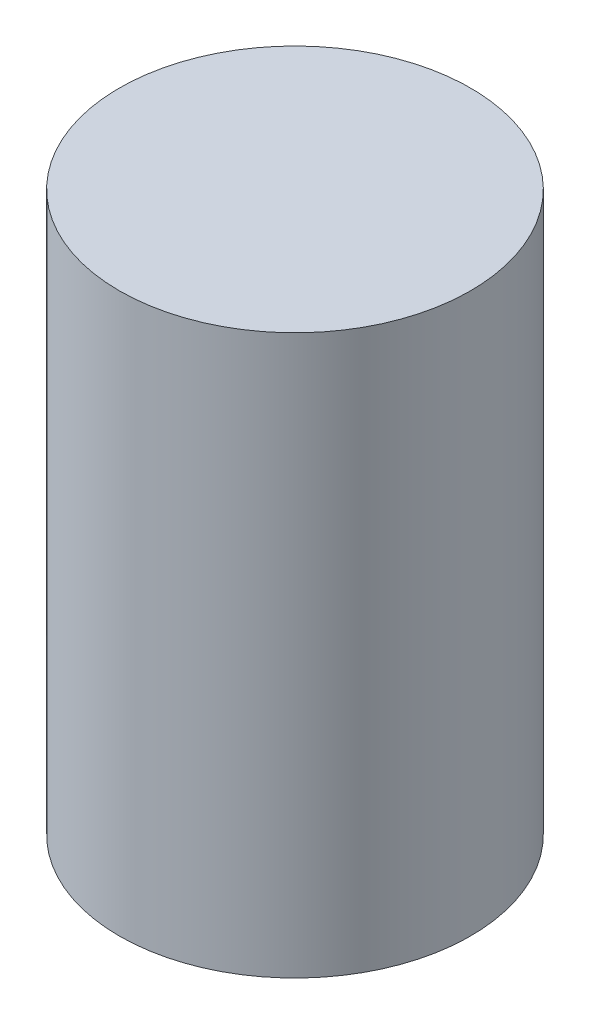
ISO-10303-21;
HEADER;
FILE_DESCRIPTION(('STEP AP214'),'2;1');
FILE_NAME('part.step','',(''),(''),'','','');
FILE_SCHEMA(('AUTOMOTIVE_DESIGN { 1 0 10303 214 1 1 1 1 }'));
ENDSEC;
DATA;
#1=APPLICATION_CONTEXT('core data for automotive mechanical design processes');
#2=APPLICATION_PROTOCOL_DEFINITION('international standard','automotive_design',2000,#1);
#3=PRODUCT_CONTEXT('',#1,'mechanical');
#4=PRODUCT('Part','Part','',(#3));
#5=PRODUCT_RELATED_PRODUCT_CATEGORY('part','',(#4));
#6=PRODUCT_DEFINITION_FORMATION('','',#4);
#7=PRODUCT_DEFINITION_CONTEXT('part definition',#1,'design');
#8=PRODUCT_DEFINITION('design','',#6,#7);
#9=PRODUCT_DEFINITION_SHAPE('','',#8);
#10=(LENGTH_UNIT() NAMED_UNIT(*) SI_UNIT(.MILLI.,.METRE.));
#11=(NAMED_UNIT(*) PLANE_ANGLE_UNIT() SI_UNIT($,.RADIAN.));
#12=(NAMED_UNIT(*) SI_UNIT($,.STERADIAN.) SOLID_ANGLE_UNIT());
#13=UNCERTAINTY_MEASURE_WITH_UNIT(LENGTH_MEASURE(1.E-05),#10,'distance_accuracy_value','');
#14=(GEOMETRIC_REPRESENTATION_CONTEXT(3) GLOBAL_UNCERTAINTY_ASSIGNED_CONTEXT((#13)) GLOBAL_UNIT_ASSIGNED_CONTEXT((#10,
#11,#12)) REPRESENTATION_CONTEXT('',''));
#15=CARTESIAN_POINT('',(0.,0.,0.));
#16=DIRECTION('',(0.,0.,1.));
#17=DIRECTION('',(1.,0.,0.));
#18=AXIS2_PLACEMENT_3D('',#15,#16,#17);
#19=CARTESIAN_POINT('',(0.,108.,0.));
#20=DIRECTION('',(0.,-1.,0.));
#21=DIRECTION('',(0.,0.,-1.));
#22=AXIS2_PLACEMENT_3D('',#19,#20,#21);
#23=CYLINDRICAL_SURFACE('',#22,33.);
#24=CARTESIAN_POINT('',(0.,108.,0.));
#25=DIRECTION('',(0.,1.,0.));
#26=DIRECTION('',(0.,0.,1.));
#27=AXIS2_PLACEMENT_3D('',#24,#25,#26);
#28=CIRCLE('',#27,33.);
#29=CARTESIAN_POINT('',(0.,108.,33.));
#30=VERTEX_POINT('',#29);
#31=EDGE_CURVE('E10',#30,#30,#28,.T.);
#32=ORIENTED_EDGE('',*,*,#31,.F.);
#33=EDGE_LOOP('',(#32));
#34=FACE_BOUND('',#33,.T.);
#35=CARTESIAN_POINT('',(0.,3.,0.));
#36=DIRECTION('',(0.,1.,0.));
#37=DIRECTION('',(0.,0.,1.));
#38=AXIS2_PLACEMENT_3D('',#35,#36,#37);
#39=CIRCLE('',#38,33.);
#40=CARTESIAN_POINT('',(0.,3.,33.));
#41=VERTEX_POINT('',#40);
#42=EDGE_CURVE('E40',#41,#41,#39,.T.);
#43=ORIENTED_EDGE('',*,*,#42,.T.);
#44=EDGE_LOOP('',(#43));
#45=FACE_BOUND('',#44,.T.);
#46=ADVANCED_FACE('F37',(#34,#45),#23,.T.);
#47=CARTESIAN_POINT('',(0.,108.,0.));
#48=DIRECTION('',(0.,1.,0.));
#49=DIRECTION('',(0.,0.,1.));
#50=AXIS2_PLACEMENT_3D('',#47,#48,#49);
#51=PLANE('',#50);
#52=ORIENTED_EDGE('',*,*,#31,.T.);
#53=EDGE_LOOP('',(#52));
#54=FACE_BOUND('',#53,.T.);
#55=ADVANCED_FACE('F52',(#54),#51,.T.);
#56=CARTESIAN_POINT('',(0.,3.,0.));
#57=DIRECTION('',(0.,1.,0.));
#58=DIRECTION('',(0.,0.,1.));
#59=AXIS2_PLACEMENT_3D('',#56,#57,#58);
#60=PLANE('',#59);
#61=ORIENTED_EDGE('',*,*,#42,.F.);
#62=EDGE_LOOP('',(#61));
#63=FACE_BOUND('',#62,.T.);
#64=ADVANCED_FACE('F50',(#63),#60,.F.);
#65=CLOSED_SHELL('',(#46,#55,#64));
#66=MANIFOLD_SOLID_BREP('B2',#65);
#67=ADVANCED_BREP_SHAPE_REPRESENTATION('',(#18,#66),#14);
#68=SHAPE_DEFINITION_REPRESENTATION(#9,#67);
ENDSEC;
END-ISO-10303-21;
